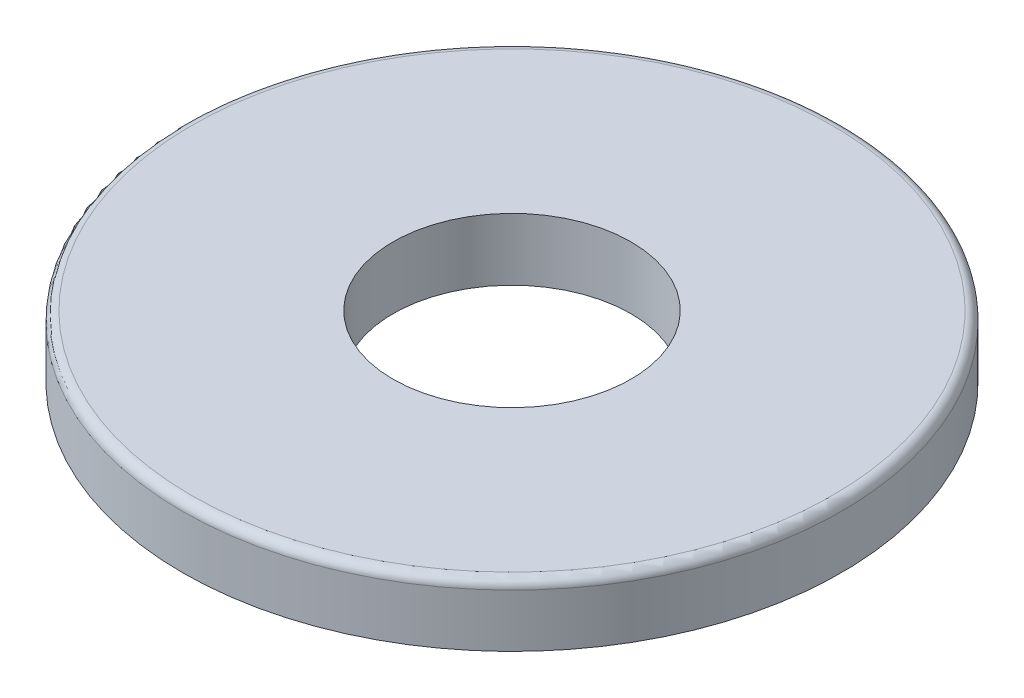
ISO-10303-21;
HEADER;
FILE_DESCRIPTION(('STEP AP214'),'2;1');
FILE_NAME('part.step','',(''),(''),'','','');
FILE_SCHEMA(('AUTOMOTIVE_DESIGN { 1 0 10303 214 1 1 1 1 }'));
ENDSEC;
DATA;
#1=APPLICATION_CONTEXT('core data for automotive mechanical design processes');
#2=APPLICATION_PROTOCOL_DEFINITION('international standard','automotive_design',2000,#1);
#3=PRODUCT_CONTEXT('',#1,'mechanical');
#4=PRODUCT('Part','Part','',(#3));
#5=PRODUCT_RELATED_PRODUCT_CATEGORY('part','',(#4));
#6=PRODUCT_DEFINITION_FORMATION('','',#4);
#7=PRODUCT_DEFINITION_CONTEXT('part definition',#1,'design');
#8=PRODUCT_DEFINITION('design','',#6,#7);
#9=PRODUCT_DEFINITION_SHAPE('','',#8);
#10=(LENGTH_UNIT() NAMED_UNIT(*) SI_UNIT(.MILLI.,.METRE.));
#11=(NAMED_UNIT(*) PLANE_ANGLE_UNIT() SI_UNIT($,.RADIAN.));
#12=(NAMED_UNIT(*) SI_UNIT($,.STERADIAN.) SOLID_ANGLE_UNIT());
#13=UNCERTAINTY_MEASURE_WITH_UNIT(LENGTH_MEASURE(1.E-05),#10,'distance_accuracy_value','');
#14=(GEOMETRIC_REPRESENTATION_CONTEXT(3) GLOBAL_UNCERTAINTY_ASSIGNED_CONTEXT((#13)) GLOBAL_UNIT_ASSIGNED_CONTEXT((#10,
#11,#12)) REPRESENTATION_CONTEXT('',''));
#15=CARTESIAN_POINT('',(0.,0.,0.));
#16=DIRECTION('',(0.,0.,1.));
#17=DIRECTION('',(1.,0.,0.));
#18=AXIS2_PLACEMENT_3D('',#15,#16,#17);
#19=CARTESIAN_POINT('',(0.,1.7,0.));
#20=DIRECTION('',(0.,1.,0.));
#21=DIRECTION('',(0.,0.,1.));
#22=AXIS2_PLACEMENT_3D('',#19,#20,#21);
#23=PLANE('',#22);
#24=CARTESIAN_POINT('',(0.,1.7,0.));
#25=DIRECTION('',(0.,1.,0.));
#26=DIRECTION('',(0.,0.,1.));
#27=AXIS2_PLACEMENT_3D('',#24,#25,#26);
#28=CIRCLE('',#27,8.75);
#29=CARTESIAN_POINT('',(0.,1.7,8.75));
#30=VERTEX_POINT('',#29);
#31=EDGE_CURVE('E36',#30,#30,#28,.T.);
#32=ORIENTED_EDGE('',*,*,#31,.T.);
#33=EDGE_LOOP('',(#32));
#34=FACE_BOUND('',#33,.T.);
#35=CARTESIAN_POINT('',(0.,1.7,0.));
#36=DIRECTION('',(0.,1.,0.));
#37=DIRECTION('',(0.,0.,1.));
#38=AXIS2_PLACEMENT_3D('',#35,#36,#37);
#39=CIRCLE('',#38,3.25);
#40=CARTESIAN_POINT('',(0.,1.7,3.25));
#41=VERTEX_POINT('',#40);
#42=EDGE_CURVE('E44',#41,#41,#39,.T.);
#43=ORIENTED_EDGE('',*,*,#42,.F.);
#44=EDGE_LOOP('',(#43));
#45=FACE_BOUND('',#44,.T.);
#46=ADVANCED_FACE('F29',(#34,#45),#23,.T.);
#47=CARTESIAN_POINT('',(0.,0.,0.));
#48=DIRECTION('',(0.,1.,0.));
#49=DIRECTION('',(0.,0.,1.));
#50=AXIS2_PLACEMENT_3D('',#47,#48,#49);
#51=PLANE('',#50);
#52=CARTESIAN_POINT('',(0.,0.,0.));
#53=DIRECTION('',(0.,1.,0.));
#54=DIRECTION('',(0.,0.,1.));
#55=AXIS2_PLACEMENT_3D('',#52,#53,#54);
#56=CIRCLE('',#55,9.);
#57=CARTESIAN_POINT('',(0.,0.,9.));
#58=VERTEX_POINT('',#57);
#59=EDGE_CURVE('E40',#58,#58,#56,.T.);
#60=ORIENTED_EDGE('',*,*,#59,.F.);
#61=EDGE_LOOP('',(#60));
#62=FACE_BOUND('',#61,.T.);
#63=CARTESIAN_POINT('',(0.,0.,0.));
#64=DIRECTION('',(0.,1.,0.));
#65=DIRECTION('',(0.,0.,1.));
#66=AXIS2_PLACEMENT_3D('',#63,#64,#65);
#67=CIRCLE('',#66,3.25);
#68=CARTESIAN_POINT('',(0.,0.,3.25));
#69=VERTEX_POINT('',#68);
#70=EDGE_CURVE('E47',#69,#69,#67,.T.);
#71=ORIENTED_EDGE('',*,*,#70,.T.);
#72=EDGE_LOOP('',(#71));
#73=FACE_BOUND('',#72,.T.);
#74=ADVANCED_FACE('F57',(#62,#73),#51,.F.);
#75=CARTESIAN_POINT('',(0.,1.7,0.));
#76=DIRECTION('',(0.,-1.,0.));
#77=DIRECTION('',(0.,0.,-1.));
#78=AXIS2_PLACEMENT_3D('',#75,#76,#77);
#79=CYLINDRICAL_SURFACE('',#78,9.);
#80=CARTESIAN_POINT('',(0.,1.45,0.));
#81=DIRECTION('',(0.,1.,0.));
#82=DIRECTION('',(0.,0.,1.));
#83=AXIS2_PLACEMENT_3D('',#80,#81,#82);
#84=CIRCLE('',#83,9.);
#85=CARTESIAN_POINT('',(0.,1.45,9.));
#86=VERTEX_POINT('',#85);
#87=EDGE_CURVE('E10',#86,#86,#84,.F.);
#88=ORIENTED_EDGE('',*,*,#87,.T.);
#89=EDGE_LOOP('',(#88));
#90=FACE_BOUND('',#89,.T.);
#91=ORIENTED_EDGE('',*,*,#59,.T.);
#92=EDGE_LOOP('',(#91));
#93=FACE_BOUND('',#92,.T.);
#94=ADVANCED_FACE('F62',(#90,#93),#79,.T.);
#95=CARTESIAN_POINT('',(0.,1.7,0.));
#96=DIRECTION('',(0.,-1.,0.));
#97=DIRECTION('',(0.,0.,-1.));
#98=AXIS2_PLACEMENT_3D('',#95,#96,#97);
#99=CYLINDRICAL_SURFACE('',#98,3.25);
#100=ORIENTED_EDGE('',*,*,#42,.T.);
#101=EDGE_LOOP('',(#100));
#102=FACE_BOUND('',#101,.T.);
#103=ORIENTED_EDGE('',*,*,#70,.F.);
#104=EDGE_LOOP('',(#103));
#105=FACE_BOUND('',#104,.T.);
#106=ADVANCED_FACE('F53',(#102,#105),#99,.F.);
#107=CARTESIAN_POINT('',(0.,1.45,0.));
#108=DIRECTION('',(0.,1.,0.));
#109=DIRECTION('',(0.,0.,1.));
#110=AXIS2_PLACEMENT_3D('',#107,#108,#109);
#111=TOROIDAL_SURFACE('',#110,8.75,0.25);
#112=ORIENTED_EDGE('',*,*,#87,.F.);
#113=EDGE_LOOP('',(#112));
#114=FACE_BOUND('',#113,.T.);
#115=ORIENTED_EDGE('',*,*,#31,.F.);
#116=EDGE_LOOP('',(#115));
#117=FACE_BOUND('',#116,.T.);
#118=ADVANCED_FACE('F31',(#114,#117),#111,.T.);
#119=CLOSED_SHELL('',(#46,#74,#94,#106,#118));
#120=MANIFOLD_SOLID_BREP('B2',#119);
#121=ADVANCED_BREP_SHAPE_REPRESENTATION('',(#18,#120),#14);
#122=SHAPE_DEFINITION_REPRESENTATION(#9,#121);
ENDSEC;
END-ISO-10303-21;
